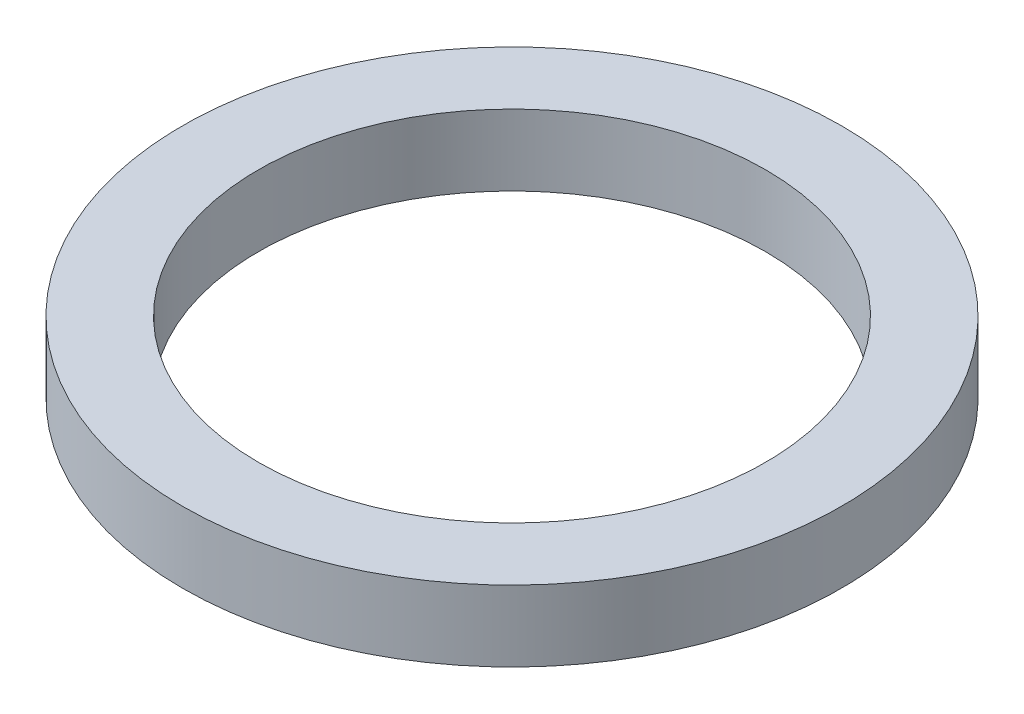
ISO-10303-21;
HEADER;
FILE_DESCRIPTION(('STEP AP214'),'2;1');
FILE_NAME('part.step','',(''),(''),'','','');
FILE_SCHEMA(('AUTOMOTIVE_DESIGN { 1 0 10303 214 1 1 1 1 }'));
ENDSEC;
DATA;
#1=APPLICATION_CONTEXT('core data for automotive mechanical design processes');
#2=APPLICATION_PROTOCOL_DEFINITION('international standard','automotive_design',2000,#1);
#3=PRODUCT_CONTEXT('',#1,'mechanical');
#4=PRODUCT('Part','Part','',(#3));
#5=PRODUCT_RELATED_PRODUCT_CATEGORY('part','',(#4));
#6=PRODUCT_DEFINITION_FORMATION('','',#4);
#7=PRODUCT_DEFINITION_CONTEXT('part definition',#1,'design');
#8=PRODUCT_DEFINITION('design','',#6,#7);
#9=PRODUCT_DEFINITION_SHAPE('','',#8);
#10=(LENGTH_UNIT() NAMED_UNIT(*) SI_UNIT(.MILLI.,.METRE.));
#11=(NAMED_UNIT(*) PLANE_ANGLE_UNIT() SI_UNIT($,.RADIAN.));
#12=(NAMED_UNIT(*) SI_UNIT($,.STERADIAN.) SOLID_ANGLE_UNIT());
#13=UNCERTAINTY_MEASURE_WITH_UNIT(LENGTH_MEASURE(1.E-05),#10,'distance_accuracy_value','');
#14=(GEOMETRIC_REPRESENTATION_CONTEXT(3) GLOBAL_UNCERTAINTY_ASSIGNED_CONTEXT((#13)) GLOBAL_UNIT_ASSIGNED_CONTEXT((#10,
#11,#12)) REPRESENTATION_CONTEXT('',''));
#15=CARTESIAN_POINT('',(0.,0.,0.));
#16=DIRECTION('',(0.,0.,1.));
#17=DIRECTION('',(1.,0.,0.));
#18=AXIS2_PLACEMENT_3D('',#15,#16,#17);
#19=CARTESIAN_POINT('',(0.,7.,0.));
#20=DIRECTION('',(0.,1.,0.));
#21=DIRECTION('',(0.,0.,1.));
#22=AXIS2_PLACEMENT_3D('',#19,#20,#21);
#23=PLANE('',#22);
#24=CARTESIAN_POINT('',(0.,7.,0.));
#25=DIRECTION('',(0.,1.,0.));
#26=DIRECTION('',(0.,0.,1.));
#27=AXIS2_PLACEMENT_3D('',#24,#25,#26);
#28=CIRCLE('',#27,32.5);
#29=CARTESIAN_POINT('',(0.,7.,32.5));
#30=VERTEX_POINT('',#29);
#31=EDGE_CURVE('E10',#30,#30,#28,.T.);
#32=ORIENTED_EDGE('',*,*,#31,.T.);
#33=EDGE_LOOP('',(#32));
#34=FACE_BOUND('',#33,.T.);
#35=CARTESIAN_POINT('',(0.,7.,0.));
#36=DIRECTION('',(0.,1.,0.));
#37=DIRECTION('',(0.,0.,1.));
#38=AXIS2_PLACEMENT_3D('',#35,#36,#37);
#39=CIRCLE('',#38,25.);
#40=CARTESIAN_POINT('',(0.,7.,25.));
#41=VERTEX_POINT('',#40);
#42=EDGE_CURVE('E43',#41,#41,#39,.T.);
#43=ORIENTED_EDGE('',*,*,#42,.F.);
#44=EDGE_LOOP('',(#43));
#45=FACE_BOUND('',#44,.T.);
#46=ADVANCED_FACE('F32',(#34,#45),#23,.T.);
#47=CARTESIAN_POINT('',(0.,0.,0.));
#48=DIRECTION('',(0.,1.,0.));
#49=DIRECTION('',(0.,0.,1.));
#50=AXIS2_PLACEMENT_3D('',#47,#48,#49);
#51=PLANE('',#50);
#52=CARTESIAN_POINT('',(0.,0.,0.));
#53=DIRECTION('',(0.,1.,0.));
#54=DIRECTION('',(0.,0.,1.));
#55=AXIS2_PLACEMENT_3D('',#52,#53,#54);
#56=CIRCLE('',#55,32.5);
#57=CARTESIAN_POINT('',(0.,0.,32.5));
#58=VERTEX_POINT('',#57);
#59=EDGE_CURVE('E36',#58,#58,#56,.T.);
#60=ORIENTED_EDGE('',*,*,#59,.F.);
#61=EDGE_LOOP('',(#60));
#62=FACE_BOUND('',#61,.T.);
#63=CARTESIAN_POINT('',(0.,0.,0.));
#64=DIRECTION('',(0.,1.,0.));
#65=DIRECTION('',(0.,0.,1.));
#66=AXIS2_PLACEMENT_3D('',#63,#64,#65);
#67=CIRCLE('',#66,25.);
#68=CARTESIAN_POINT('',(0.,0.,25.));
#69=VERTEX_POINT('',#68);
#70=EDGE_CURVE('E45',#69,#69,#67,.T.);
#71=ORIENTED_EDGE('',*,*,#70,.T.);
#72=EDGE_LOOP('',(#71));
#73=FACE_BOUND('',#72,.T.);
#74=ADVANCED_FACE('F55',(#62,#73),#51,.F.);
#75=CARTESIAN_POINT('',(0.,7.,0.));
#76=DIRECTION('',(0.,-1.,0.));
#77=DIRECTION('',(0.,0.,-1.));
#78=AXIS2_PLACEMENT_3D('',#75,#76,#77);
#79=CYLINDRICAL_SURFACE('',#78,32.5);
#80=ORIENTED_EDGE('',*,*,#31,.F.);
#81=EDGE_LOOP('',(#80));
#82=FACE_BOUND('',#81,.T.);
#83=ORIENTED_EDGE('',*,*,#59,.T.);
#84=EDGE_LOOP('',(#83));
#85=FACE_BOUND('',#84,.T.);
#86=ADVANCED_FACE('F34',(#82,#85),#79,.T.);
#87=CARTESIAN_POINT('',(0.,7.,0.));
#88=DIRECTION('',(0.,-1.,0.));
#89=DIRECTION('',(0.,0.,-1.));
#90=AXIS2_PLACEMENT_3D('',#87,#88,#89);
#91=CYLINDRICAL_SURFACE('',#90,25.);
#92=ORIENTED_EDGE('',*,*,#42,.T.);
#93=EDGE_LOOP('',(#92));
#94=FACE_BOUND('',#93,.T.);
#95=ORIENTED_EDGE('',*,*,#70,.F.);
#96=EDGE_LOOP('',(#95));
#97=FACE_BOUND('',#96,.T.);
#98=ADVANCED_FACE('F51',(#94,#97),#91,.F.);
#99=CLOSED_SHELL('',(#46,#74,#86,#98));
#100=MANIFOLD_SOLID_BREP('B2',#99);
#101=ADVANCED_BREP_SHAPE_REPRESENTATION('',(#18,#100),#14);
#102=SHAPE_DEFINITION_REPRESENTATION(#9,#101);
ENDSEC;
END-ISO-10303-21;
